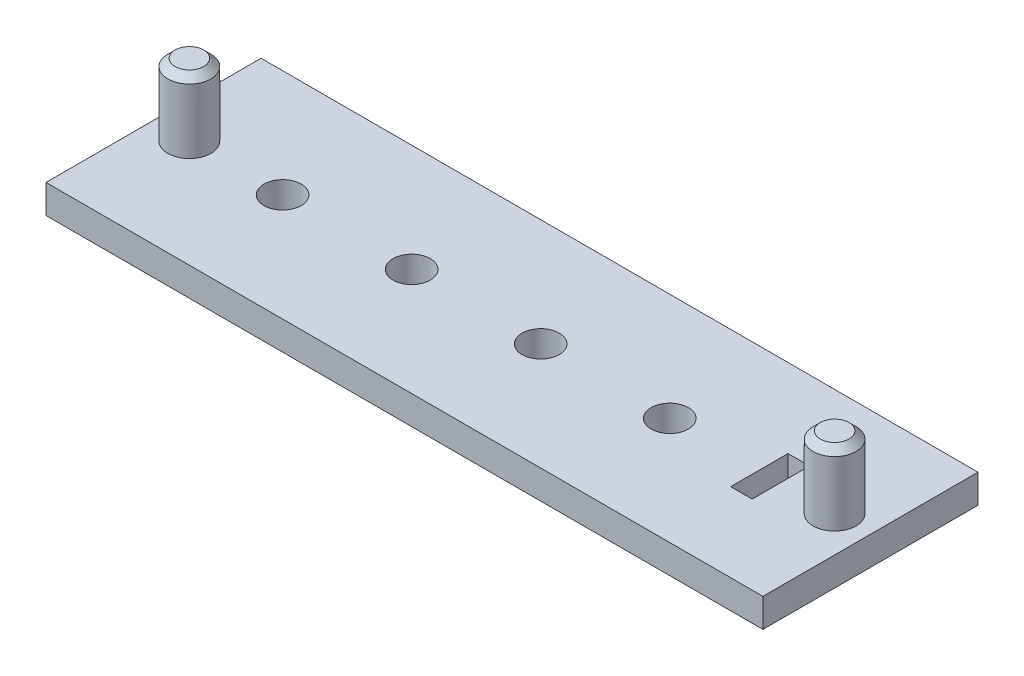
ISO-10303-21;
HEADER;
FILE_DESCRIPTION(('STEP AP214'),'2;1');
FILE_NAME('part.step','',(''),(''),'','','');
FILE_SCHEMA(('AUTOMOTIVE_DESIGN { 1 0 10303 214 1 1 1 1 }'));
ENDSEC;
DATA;
#1=APPLICATION_CONTEXT('core data for automotive mechanical design processes');
#2=APPLICATION_PROTOCOL_DEFINITION('international standard','automotive_design',2000,#1);
#3=PRODUCT_CONTEXT('',#1,'mechanical');
#4=PRODUCT('Part','Part','',(#3));
#5=PRODUCT_RELATED_PRODUCT_CATEGORY('part','',(#4));
#6=PRODUCT_DEFINITION_FORMATION('','',#4);
#7=PRODUCT_DEFINITION_CONTEXT('part definition',#1,'design');
#8=PRODUCT_DEFINITION('design','',#6,#7);
#9=PRODUCT_DEFINITION_SHAPE('','',#8);
#10=(LENGTH_UNIT() NAMED_UNIT(*) SI_UNIT(.MILLI.,.METRE.));
#11=(NAMED_UNIT(*) PLANE_ANGLE_UNIT() SI_UNIT($,.RADIAN.));
#12=(NAMED_UNIT(*) SI_UNIT($,.STERADIAN.) SOLID_ANGLE_UNIT());
#13=UNCERTAINTY_MEASURE_WITH_UNIT(LENGTH_MEASURE(1.E-05),#10,'distance_accuracy_value','');
#14=(GEOMETRIC_REPRESENTATION_CONTEXT(3) GLOBAL_UNCERTAINTY_ASSIGNED_CONTEXT((#13)) GLOBAL_UNIT_ASSIGNED_CONTEXT((#10,
#11,#12)) REPRESENTATION_CONTEXT('',''));
#15=CARTESIAN_POINT('',(0.,0.,0.));
#16=DIRECTION('',(0.,0.,1.));
#17=DIRECTION('',(1.,0.,0.));
#18=AXIS2_PLACEMENT_3D('',#15,#16,#17);
#19=CARTESIAN_POINT('',(0.,2.,0.));
#20=DIRECTION('',(0.,-1.,0.));
#21=DIRECTION('',(0.,0.,-1.));
#22=AXIS2_PLACEMENT_3D('',#19,#20,#21);
#23=PLANE('',#22);
#24=CARTESIAN_POINT('',(-22.5,2.,0.));
#25=DIRECTION('',(0.,-1.,0.));
#26=DIRECTION('',(0.,0.,-1.));
#27=AXIS2_PLACEMENT_3D('',#24,#25,#26);
#28=CIRCLE('',#27,1.5);
#29=CARTESIAN_POINT('',(-22.5,2.,-1.5));
#30=VERTEX_POINT('',#29);
#31=EDGE_CURVE('E174',#30,#30,#28,.F.);
#32=ORIENTED_EDGE('',*,*,#31,.F.);
#33=EDGE_LOOP('',(#32));
#34=FACE_BOUND('',#33,.T.);
#35=CARTESIAN_POINT('',(1.99999999999998,2.,0.));
#36=DIRECTION('',(0.,1.,0.));
#37=DIRECTION('',(0.,0.,1.));
#38=AXIS2_PLACEMENT_3D('',#35,#36,#37);
#39=CIRCLE('',#38,1.3);
#40=CARTESIAN_POINT('',(1.99999999999998,2.,1.3));
#41=VERTEX_POINT('',#40);
#42=EDGE_CURVE('E313',#41,#41,#39,.T.);
#43=ORIENTED_EDGE('',*,*,#42,.F.);
#44=EDGE_LOOP('',(#43));
#45=FACE_BOUND('',#44,.T.);
#46=DIRECTION('',(0.,0.,-1.));
#47=VECTOR('',#46,1.);
#48=CARTESIAN_POINT('',(18.75,2.,2.));
#49=LINE('',#48,#47);
#50=CARTESIAN_POINT('',(18.75,2.,2.));
#51=VERTEX_POINT('',#50);
#52=CARTESIAN_POINT('',(18.75,2.,-2.));
#53=VERTEX_POINT('',#52);
#54=EDGE_CURVE('E100',#51,#53,#49,.T.);
#55=ORIENTED_EDGE('',*,*,#54,.F.);
#56=DIRECTION('',(1.,0.,0.));
#57=VECTOR('',#56,1.);
#58=CARTESIAN_POINT('',(17.25,2.,2.));
#59=LINE('',#58,#57);
#60=CARTESIAN_POINT('',(17.25,2.,2.));
#61=VERTEX_POINT('',#60);
#62=EDGE_CURVE('E123',#61,#51,#59,.T.);
#63=ORIENTED_EDGE('',*,*,#62,.F.);
#64=DIRECTION('',(0.,0.,1.));
#65=VECTOR('',#64,1.);
#66=CARTESIAN_POINT('',(17.25,2.,2.));
#67=LINE('',#66,#65);
#68=CARTESIAN_POINT('',(17.25,2.,-2.));
#69=VERTEX_POINT('',#68);
#70=EDGE_CURVE('E121',#69,#61,#67,.T.);
#71=ORIENTED_EDGE('',*,*,#70,.F.);
#72=DIRECTION('',(-1.,0.,0.));
#73=VECTOR('',#72,1.);
#74=CARTESIAN_POINT('',(17.25,2.,-2.));
#75=LINE('',#74,#73);
#76=EDGE_CURVE('E108',#53,#69,#75,.T.);
#77=ORIENTED_EDGE('',*,*,#76,.F.);
#78=EDGE_LOOP('',(#55,#63,#71,#77));
#79=FACE_BOUND('',#78,.T.);
#80=DIRECTION('',(0.,0.,-1.));
#81=VECTOR('',#80,1.);
#82=CARTESIAN_POINT('',(25.,2.,7.5));
#83=LINE('',#82,#81);
#84=CARTESIAN_POINT('',(25.,2.,7.5));
#85=VERTEX_POINT('',#84);
#86=CARTESIAN_POINT('',(25.,2.,-7.5));
#87=VERTEX_POINT('',#86);
#88=EDGE_CURVE('E145',#85,#87,#83,.T.);
#89=ORIENTED_EDGE('',*,*,#88,.T.);
#90=DIRECTION('',(-1.,0.,0.));
#91=VECTOR('',#90,1.);
#92=CARTESIAN_POINT('',(-25.,2.,-7.5));
#93=LINE('',#92,#91);
#94=CARTESIAN_POINT('',(-25.,2.,-7.5));
#95=VERTEX_POINT('',#94);
#96=EDGE_CURVE('E148',#87,#95,#93,.T.);
#97=ORIENTED_EDGE('',*,*,#96,.T.);
#98=DIRECTION('',(0.,0.,1.));
#99=VECTOR('',#98,1.);
#100=CARTESIAN_POINT('',(-25.,2.,7.5));
#101=LINE('',#100,#99);
#102=CARTESIAN_POINT('',(-25.,2.,7.5));
#103=VERTEX_POINT('',#102);
#104=EDGE_CURVE('E151',#95,#103,#101,.T.);
#105=ORIENTED_EDGE('',*,*,#104,.T.);
#106=DIRECTION('',(1.,0.,0.));
#107=VECTOR('',#106,1.);
#108=CARTESIAN_POINT('',(-25.,2.,7.5));
#109=LINE('',#108,#107);
#110=EDGE_CURVE('E153',#103,#85,#109,.T.);
#111=ORIENTED_EDGE('',*,*,#110,.T.);
#112=EDGE_LOOP('',(#89,#97,#105,#111));
#113=FACE_BOUND('',#112,.T.);
#114=CARTESIAN_POINT('',(-16.,2.,0.));
#115=DIRECTION('',(0.,1.,0.));
#116=DIRECTION('',(0.,0.,1.));
#117=AXIS2_PLACEMENT_3D('',#114,#115,#116);
#118=CIRCLE('',#117,1.3);
#119=CARTESIAN_POINT('',(-16.,2.,1.3));
#120=VERTEX_POINT('',#119);
#121=EDGE_CURVE('E139',#120,#120,#118,.T.);
#122=ORIENTED_EDGE('',*,*,#121,.F.);
#123=EDGE_LOOP('',(#122));
#124=FACE_BOUND('',#123,.T.);
#125=CARTESIAN_POINT('',(-7.00000000000002,2.,0.));
#126=DIRECTION('',(0.,1.,0.));
#127=DIRECTION('',(0.,0.,1.));
#128=AXIS2_PLACEMENT_3D('',#125,#126,#127);
#129=CIRCLE('',#128,1.3);
#130=CARTESIAN_POINT('',(-7.00000000000002,2.,1.3));
#131=VERTEX_POINT('',#130);
#132=EDGE_CURVE('E129',#131,#131,#129,.T.);
#133=ORIENTED_EDGE('',*,*,#132,.F.);
#134=EDGE_LOOP('',(#133));
#135=FACE_BOUND('',#134,.T.);
#136=CARTESIAN_POINT('',(11.,2.,0.));
#137=DIRECTION('',(0.,1.,0.));
#138=DIRECTION('',(0.,0.,1.));
#139=AXIS2_PLACEMENT_3D('',#136,#137,#138);
#140=CIRCLE('',#139,1.3);
#141=CARTESIAN_POINT('',(11.,2.,1.3));
#142=VERTEX_POINT('',#141);
#143=EDGE_CURVE('E251',#142,#142,#140,.T.);
#144=ORIENTED_EDGE('',*,*,#143,.F.);
#145=EDGE_LOOP('',(#144));
#146=FACE_BOUND('',#145,.T.);
#147=CARTESIAN_POINT('',(22.5,2.,0.));
#148=DIRECTION('',(0.,-1.,0.));
#149=DIRECTION('',(0.,0.,-1.));
#150=AXIS2_PLACEMENT_3D('',#147,#148,#149);
#151=CIRCLE('',#150,1.5);
#152=CARTESIAN_POINT('',(22.5,2.,-1.5));
#153=VERTEX_POINT('',#152);
#154=EDGE_CURVE('E177',#153,#153,#151,.F.);
#155=ORIENTED_EDGE('',*,*,#154,.F.);
#156=EDGE_LOOP('',(#155));
#157=FACE_BOUND('',#156,.T.);
#158=ADVANCED_FACE('F35',(#34,#45,#79,#113,#124,#135,#146,#157),#23,.F.);
#159=CARTESIAN_POINT('',(0.,0.,0.));
#160=DIRECTION('',(0.,-1.,0.));
#161=DIRECTION('',(0.,0.,-1.));
#162=AXIS2_PLACEMENT_3D('',#159,#160,#161);
#163=PLANE('',#162);
#164=CARTESIAN_POINT('',(1.99999999999998,0.,0.));
#165=DIRECTION('',(0.,1.,0.));
#166=DIRECTION('',(0.,0.,1.));
#167=AXIS2_PLACEMENT_3D('',#164,#165,#166);
#168=CIRCLE('',#167,1.3);
#169=CARTESIAN_POINT('',(1.99999999999998,0.,1.3));
#170=VERTEX_POINT('',#169);
#171=EDGE_CURVE('E310',#170,#170,#168,.T.);
#172=ORIENTED_EDGE('',*,*,#171,.T.);
#173=EDGE_LOOP('',(#172));
#174=FACE_BOUND('',#173,.T.);
#175=DIRECTION('',(1.,0.,0.));
#176=VECTOR('',#175,1.);
#177=CARTESIAN_POINT('',(17.25,0.,2.));
#178=LINE('',#177,#176);
#179=CARTESIAN_POINT('',(17.25,0.,2.));
#180=VERTEX_POINT('',#179);
#181=CARTESIAN_POINT('',(18.75,0.,2.));
#182=VERTEX_POINT('',#181);
#183=EDGE_CURVE('E109',#180,#182,#178,.T.);
#184=ORIENTED_EDGE('',*,*,#183,.T.);
#185=DIRECTION('',(0.,0.,-1.));
#186=VECTOR('',#185,1.);
#187=CARTESIAN_POINT('',(18.75,0.,2.));
#188=LINE('',#187,#186);
#189=CARTESIAN_POINT('',(18.75,0.,-2.));
#190=VERTEX_POINT('',#189);
#191=EDGE_CURVE('E58',#182,#190,#188,.T.);
#192=ORIENTED_EDGE('',*,*,#191,.T.);
#193=DIRECTION('',(-1.,0.,0.));
#194=VECTOR('',#193,1.);
#195=CARTESIAN_POINT('',(17.25,0.,-2.));
#196=LINE('',#195,#194);
#197=CARTESIAN_POINT('',(17.25,0.,-2.));
#198=VERTEX_POINT('',#197);
#199=EDGE_CURVE('E115',#190,#198,#196,.T.);
#200=ORIENTED_EDGE('',*,*,#199,.T.);
#201=DIRECTION('',(0.,0.,1.));
#202=VECTOR('',#201,1.);
#203=CARTESIAN_POINT('',(17.25,0.,2.));
#204=LINE('',#203,#202);
#205=EDGE_CURVE('E131',#198,#180,#204,.T.);
#206=ORIENTED_EDGE('',*,*,#205,.T.);
#207=EDGE_LOOP('',(#184,#192,#200,#206));
#208=FACE_BOUND('',#207,.T.);
#209=DIRECTION('',(0.,0.,-1.));
#210=VECTOR('',#209,1.);
#211=CARTESIAN_POINT('',(25.,0.,7.5));
#212=LINE('',#211,#210);
#213=CARTESIAN_POINT('',(25.,0.,7.5));
#214=VERTEX_POINT('',#213);
#215=CARTESIAN_POINT('',(25.,0.,-7.5));
#216=VERTEX_POINT('',#215);
#217=EDGE_CURVE('E142',#214,#216,#212,.T.);
#218=ORIENTED_EDGE('',*,*,#217,.F.);
#219=DIRECTION('',(1.,0.,0.));
#220=VECTOR('',#219,1.);
#221=CARTESIAN_POINT('',(-25.,0.,7.5));
#222=LINE('',#221,#220);
#223=CARTESIAN_POINT('',(-25.,0.,7.5));
#224=VERTEX_POINT('',#223);
#225=EDGE_CURVE('E149',#224,#214,#222,.T.);
#226=ORIENTED_EDGE('',*,*,#225,.F.);
#227=DIRECTION('',(0.,0.,1.));
#228=VECTOR('',#227,1.);
#229=CARTESIAN_POINT('',(-25.,0.,7.5));
#230=LINE('',#229,#228);
#231=CARTESIAN_POINT('',(-25.,0.,-7.5));
#232=VERTEX_POINT('',#231);
#233=EDGE_CURVE('E160',#232,#224,#230,.T.);
#234=ORIENTED_EDGE('',*,*,#233,.F.);
#235=DIRECTION('',(-1.,0.,0.));
#236=VECTOR('',#235,1.);
#237=CARTESIAN_POINT('',(-25.,0.,-7.5));
#238=LINE('',#237,#236);
#239=EDGE_CURVE('E158',#216,#232,#238,.T.);
#240=ORIENTED_EDGE('',*,*,#239,.F.);
#241=EDGE_LOOP('',(#218,#226,#234,#240));
#242=FACE_BOUND('',#241,.T.);
#243=CARTESIAN_POINT('',(-16.,0.,0.));
#244=DIRECTION('',(0.,1.,0.));
#245=DIRECTION('',(0.,0.,1.));
#246=AXIS2_PLACEMENT_3D('',#243,#244,#245);
#247=CIRCLE('',#246,1.3);
#248=CARTESIAN_POINT('',(-16.,0.,1.3));
#249=VERTEX_POINT('',#248);
#250=EDGE_CURVE('E116',#249,#249,#247,.T.);
#251=ORIENTED_EDGE('',*,*,#250,.T.);
#252=EDGE_LOOP('',(#251));
#253=FACE_BOUND('',#252,.T.);
#254=CARTESIAN_POINT('',(-7.00000000000002,0.,0.));
#255=DIRECTION('',(0.,1.,0.));
#256=DIRECTION('',(0.,0.,1.));
#257=AXIS2_PLACEMENT_3D('',#254,#255,#256);
#258=CIRCLE('',#257,1.3);
#259=CARTESIAN_POINT('',(-7.00000000000002,0.,1.3));
#260=VERTEX_POINT('',#259);
#261=EDGE_CURVE('E304',#260,#260,#258,.T.);
#262=ORIENTED_EDGE('',*,*,#261,.T.);
#263=EDGE_LOOP('',(#262));
#264=FACE_BOUND('',#263,.T.);
#265=CARTESIAN_POINT('',(11.,0.,0.));
#266=DIRECTION('',(0.,1.,0.));
#267=DIRECTION('',(0.,0.,1.));
#268=AXIS2_PLACEMENT_3D('',#265,#266,#267);
#269=CIRCLE('',#268,1.3);
#270=CARTESIAN_POINT('',(11.,0.,1.3));
#271=VERTEX_POINT('',#270);
#272=EDGE_CURVE('E307',#271,#271,#269,.T.);
#273=ORIENTED_EDGE('',*,*,#272,.T.);
#274=EDGE_LOOP('',(#273));
#275=FACE_BOUND('',#274,.T.);
#276=ADVANCED_FACE('F199',(#174,#208,#242,#253,#264,#275),#163,.T.);
#277=CARTESIAN_POINT('',(25.,2.,7.5));
#278=DIRECTION('',(-1.,0.,0.));
#279=DIRECTION('',(0.,0.,1.));
#280=AXIS2_PLACEMENT_3D('',#277,#278,#279);
#281=PLANE('',#280);
#282=ORIENTED_EDGE('',*,*,#217,.T.);
#283=DIRECTION('',(0.,-1.,0.));
#284=VECTOR('',#283,1.);
#285=CARTESIAN_POINT('',(25.,2.,-7.5));
#286=LINE('',#285,#284);
#287=EDGE_CURVE('E171',#87,#216,#286,.T.);
#288=ORIENTED_EDGE('',*,*,#287,.F.);
#289=ORIENTED_EDGE('',*,*,#88,.F.);
#290=DIRECTION('',(0.,-1.,0.));
#291=VECTOR('',#290,1.);
#292=CARTESIAN_POINT('',(25.,2.,7.5));
#293=LINE('',#292,#291);
#294=EDGE_CURVE('E155',#85,#214,#293,.T.);
#295=ORIENTED_EDGE('',*,*,#294,.T.);
#296=EDGE_LOOP('',(#282,#288,#289,#295));
#297=FACE_BOUND('',#296,.T.);
#298=ADVANCED_FACE('F205',(#297),#281,.F.);
#299=CARTESIAN_POINT('',(-25.,2.,-7.5));
#300=DIRECTION('',(0.,0.,1.));
#301=DIRECTION('',(1.,0.,0.));
#302=AXIS2_PLACEMENT_3D('',#299,#300,#301);
#303=PLANE('',#302);
#304=ORIENTED_EDGE('',*,*,#239,.T.);
#305=DIRECTION('',(0.,-1.,0.));
#306=VECTOR('',#305,1.);
#307=CARTESIAN_POINT('',(-25.,2.,-7.5));
#308=LINE('',#307,#306);
#309=EDGE_CURVE('E168',#95,#232,#308,.T.);
#310=ORIENTED_EDGE('',*,*,#309,.F.);
#311=ORIENTED_EDGE('',*,*,#96,.F.);
#312=ORIENTED_EDGE('',*,*,#287,.T.);
#313=EDGE_LOOP('',(#304,#310,#311,#312));
#314=FACE_BOUND('',#313,.T.);
#315=ADVANCED_FACE('F221',(#314),#303,.F.);
#316=CARTESIAN_POINT('',(-25.,2.,7.5));
#317=DIRECTION('',(1.,0.,0.));
#318=DIRECTION('',(0.,0.,-1.));
#319=AXIS2_PLACEMENT_3D('',#316,#317,#318);
#320=PLANE('',#319);
#321=ORIENTED_EDGE('',*,*,#233,.T.);
#322=DIRECTION('',(0.,-1.,0.));
#323=VECTOR('',#322,1.);
#324=CARTESIAN_POINT('',(-25.,2.,7.5));
#325=LINE('',#324,#323);
#326=EDGE_CURVE('E165',#103,#224,#325,.T.);
#327=ORIENTED_EDGE('',*,*,#326,.F.);
#328=ORIENTED_EDGE('',*,*,#104,.F.);
#329=ORIENTED_EDGE('',*,*,#309,.T.);
#330=EDGE_LOOP('',(#321,#327,#328,#329));
#331=FACE_BOUND('',#330,.T.);
#332=ADVANCED_FACE('F217',(#331),#320,.F.);
#333=CARTESIAN_POINT('',(-25.,2.,7.5));
#334=DIRECTION('',(0.,0.,-1.));
#335=DIRECTION('',(-1.,0.,0.));
#336=AXIS2_PLACEMENT_3D('',#333,#334,#335);
#337=PLANE('',#336);
#338=ORIENTED_EDGE('',*,*,#225,.T.);
#339=ORIENTED_EDGE('',*,*,#294,.F.);
#340=ORIENTED_EDGE('',*,*,#110,.F.);
#341=ORIENTED_EDGE('',*,*,#326,.T.);
#342=EDGE_LOOP('',(#338,#339,#340,#341));
#343=FACE_BOUND('',#342,.T.);
#344=ADVANCED_FACE('F214',(#343),#337,.F.);
#345=CARTESIAN_POINT('',(-16.,2.,0.));
#346=DIRECTION('',(0.,-1.,0.));
#347=DIRECTION('',(0.,0.,-1.));
#348=AXIS2_PLACEMENT_3D('',#345,#346,#347);
#349=CYLINDRICAL_SURFACE('',#348,1.3);
#350=ORIENTED_EDGE('',*,*,#121,.T.);
#351=EDGE_LOOP('',(#350));
#352=FACE_BOUND('',#351,.T.);
#353=ORIENTED_EDGE('',*,*,#250,.F.);
#354=EDGE_LOOP('',(#353));
#355=FACE_BOUND('',#354,.T.);
#356=ADVANCED_FACE('F211',(#352,#355),#349,.F.);
#357=CARTESIAN_POINT('',(18.75,2.,2.));
#358=DIRECTION('',(-1.,0.,0.));
#359=DIRECTION('',(0.,0.,1.));
#360=AXIS2_PLACEMENT_3D('',#357,#358,#359);
#361=PLANE('',#360);
#362=ORIENTED_EDGE('',*,*,#191,.F.);
#363=DIRECTION('',(0.,-1.,0.));
#364=VECTOR('',#363,1.);
#365=CARTESIAN_POINT('',(18.75,2.,2.));
#366=LINE('',#365,#364);
#367=EDGE_CURVE('E104',#51,#182,#366,.T.);
#368=ORIENTED_EDGE('',*,*,#367,.F.);
#369=ORIENTED_EDGE('',*,*,#54,.T.);
#370=DIRECTION('',(0.,-1.,0.));
#371=VECTOR('',#370,1.);
#372=CARTESIAN_POINT('',(18.75,2.,-2.));
#373=LINE('',#372,#371);
#374=EDGE_CURVE('E103',#53,#190,#373,.T.);
#375=ORIENTED_EDGE('',*,*,#374,.T.);
#376=EDGE_LOOP('',(#362,#368,#369,#375));
#377=FACE_BOUND('',#376,.T.);
#378=ADVANCED_FACE('F102',(#377),#361,.T.);
#379=CARTESIAN_POINT('',(17.25,2.,-2.));
#380=DIRECTION('',(0.,0.,1.));
#381=DIRECTION('',(1.,0.,0.));
#382=AXIS2_PLACEMENT_3D('',#379,#380,#381);
#383=PLANE('',#382);
#384=ORIENTED_EDGE('',*,*,#199,.F.);
#385=ORIENTED_EDGE('',*,*,#374,.F.);
#386=ORIENTED_EDGE('',*,*,#76,.T.);
#387=DIRECTION('',(0.,-1.,0.));
#388=VECTOR('',#387,1.);
#389=CARTESIAN_POINT('',(17.25,2.,-2.));
#390=LINE('',#389,#388);
#391=EDGE_CURVE('E117',#69,#198,#390,.T.);
#392=ORIENTED_EDGE('',*,*,#391,.T.);
#393=EDGE_LOOP('',(#384,#385,#386,#392));
#394=FACE_BOUND('',#393,.T.);
#395=ADVANCED_FACE('F112',(#394),#383,.T.);
#396=CARTESIAN_POINT('',(17.25,2.,2.));
#397=DIRECTION('',(1.,0.,0.));
#398=DIRECTION('',(0.,0.,-1.));
#399=AXIS2_PLACEMENT_3D('',#396,#397,#398);
#400=PLANE('',#399);
#401=ORIENTED_EDGE('',*,*,#205,.F.);
#402=ORIENTED_EDGE('',*,*,#391,.F.);
#403=ORIENTED_EDGE('',*,*,#70,.T.);
#404=DIRECTION('',(0.,-1.,0.));
#405=VECTOR('',#404,1.);
#406=CARTESIAN_POINT('',(17.25,2.,2.));
#407=LINE('',#406,#405);
#408=EDGE_CURVE('E50',#61,#180,#407,.T.);
#409=ORIENTED_EDGE('',*,*,#408,.T.);
#410=EDGE_LOOP('',(#401,#402,#403,#409));
#411=FACE_BOUND('',#410,.T.);
#412=ADVANCED_FACE('F286',(#411),#400,.T.);
#413=CARTESIAN_POINT('',(17.25,2.,2.));
#414=DIRECTION('',(0.,0.,-1.));
#415=DIRECTION('',(-1.,0.,0.));
#416=AXIS2_PLACEMENT_3D('',#413,#414,#415);
#417=PLANE('',#416);
#418=ORIENTED_EDGE('',*,*,#183,.F.);
#419=ORIENTED_EDGE('',*,*,#408,.F.);
#420=ORIENTED_EDGE('',*,*,#62,.T.);
#421=ORIENTED_EDGE('',*,*,#367,.T.);
#422=EDGE_LOOP('',(#418,#419,#420,#421));
#423=FACE_BOUND('',#422,.T.);
#424=ADVANCED_FACE('F282',(#423),#417,.T.);
#425=CARTESIAN_POINT('',(-7.00000000000002,2.,0.));
#426=DIRECTION('',(0.,-1.,0.));
#427=DIRECTION('',(0.,0.,-1.));
#428=AXIS2_PLACEMENT_3D('',#425,#426,#427);
#429=CYLINDRICAL_SURFACE('',#428,1.3);
#430=ORIENTED_EDGE('',*,*,#132,.T.);
#431=EDGE_LOOP('',(#430));
#432=FACE_BOUND('',#431,.T.);
#433=ORIENTED_EDGE('',*,*,#261,.F.);
#434=EDGE_LOOP('',(#433));
#435=FACE_BOUND('',#434,.T.);
#436=ADVANCED_FACE('F278',(#432,#435),#429,.F.);
#437=CARTESIAN_POINT('',(1.99999999999998,2.,0.));
#438=DIRECTION('',(0.,-1.,0.));
#439=DIRECTION('',(0.,0.,-1.));
#440=AXIS2_PLACEMENT_3D('',#437,#438,#439);
#441=CYLINDRICAL_SURFACE('',#440,1.3);
#442=ORIENTED_EDGE('',*,*,#42,.T.);
#443=EDGE_LOOP('',(#442));
#444=FACE_BOUND('',#443,.T.);
#445=ORIENTED_EDGE('',*,*,#171,.F.);
#446=EDGE_LOOP('',(#445));
#447=FACE_BOUND('',#446,.T.);
#448=ADVANCED_FACE('F274',(#444,#447),#441,.F.);
#449=CARTESIAN_POINT('',(11.,2.,0.));
#450=DIRECTION('',(0.,-1.,0.));
#451=DIRECTION('',(0.,0.,-1.));
#452=AXIS2_PLACEMENT_3D('',#449,#450,#451);
#453=CYLINDRICAL_SURFACE('',#452,1.3);
#454=ORIENTED_EDGE('',*,*,#143,.T.);
#455=EDGE_LOOP('',(#454));
#456=FACE_BOUND('',#455,.T.);
#457=ORIENTED_EDGE('',*,*,#272,.F.);
#458=EDGE_LOOP('',(#457));
#459=FACE_BOUND('',#458,.T.);
#460=ADVANCED_FACE('F270',(#456,#459),#453,.F.);
#461=CARTESIAN_POINT('',(-22.5,7.,0.));
#462=DIRECTION('',(0.,-1.,0.));
#463=DIRECTION('',(0.,0.,-1.));
#464=AXIS2_PLACEMENT_3D('',#461,#462,#463);
#465=CYLINDRICAL_SURFACE('',#464,1.5);
#466=CARTESIAN_POINT('',(-22.5,6.49999999999999,0.));
#467=DIRECTION('',(0.,1.,0.));
#468=DIRECTION('',(0.,0.,1.));
#469=AXIS2_PLACEMENT_3D('',#466,#467,#468);
#470=CIRCLE('',#469,1.5);
#471=CARTESIAN_POINT('',(-22.5,6.49999999999999,1.5));
#472=VERTEX_POINT('',#471);
#473=EDGE_CURVE('E183',#472,#472,#470,.F.);
#474=ORIENTED_EDGE('',*,*,#473,.T.);
#475=EDGE_LOOP('',(#474));
#476=FACE_BOUND('',#475,.T.);
#477=ORIENTED_EDGE('',*,*,#31,.T.);
#478=EDGE_LOOP('',(#477));
#479=FACE_BOUND('',#478,.T.);
#480=ADVANCED_FACE('F264',(#476,#479),#465,.T.);
#481=CARTESIAN_POINT('',(-22.5,7.,0.));
#482=DIRECTION('',(0.,1.,0.));
#483=DIRECTION('',(0.,0.,1.));
#484=AXIS2_PLACEMENT_3D('',#481,#482,#483);
#485=PLANE('',#484);
#486=CARTESIAN_POINT('',(-22.5,7.,0.));
#487=DIRECTION('',(0.,1.,0.));
#488=DIRECTION('',(0.,0.,1.));
#489=AXIS2_PLACEMENT_3D('',#486,#487,#488);
#490=CIRCLE('',#489,0.999999999999994);
#491=CARTESIAN_POINT('',(-22.5,7.,0.999999999999994));
#492=VERTEX_POINT('',#491);
#493=EDGE_CURVE('E180',#492,#492,#490,.T.);
#494=ORIENTED_EDGE('',*,*,#493,.T.);
#495=EDGE_LOOP('',(#494));
#496=FACE_BOUND('',#495,.T.);
#497=ADVANCED_FACE('F256',(#496),#485,.T.);
#498=CARTESIAN_POINT('',(22.5,7.,0.));
#499=DIRECTION('',(0.,-1.,0.));
#500=DIRECTION('',(0.,0.,-1.));
#501=AXIS2_PLACEMENT_3D('',#498,#499,#500);
#502=CYLINDRICAL_SURFACE('',#501,1.5);
#503=CARTESIAN_POINT('',(22.5,6.49999999999999,0.));
#504=DIRECTION('',(0.,1.,0.));
#505=DIRECTION('',(0.,0.,1.));
#506=AXIS2_PLACEMENT_3D('',#503,#504,#505);
#507=CIRCLE('',#506,1.5);
#508=CARTESIAN_POINT('',(22.5,6.49999999999999,1.5));
#509=VERTEX_POINT('',#508);
#510=EDGE_CURVE('E11',#509,#509,#507,.F.);
#511=ORIENTED_EDGE('',*,*,#510,.T.);
#512=EDGE_LOOP('',(#511));
#513=FACE_BOUND('',#512,.T.);
#514=ORIENTED_EDGE('',*,*,#154,.T.);
#515=EDGE_LOOP('',(#514));
#516=FACE_BOUND('',#515,.T.);
#517=ADVANCED_FACE('F254',(#513,#516),#502,.T.);
#518=CARTESIAN_POINT('',(22.5,7.,0.));
#519=DIRECTION('',(0.,1.,0.));
#520=DIRECTION('',(0.,0.,1.));
#521=AXIS2_PLACEMENT_3D('',#518,#519,#520);
#522=PLANE('',#521);
#523=CARTESIAN_POINT('',(22.5,7.,0.));
#524=DIRECTION('',(0.,1.,0.));
#525=DIRECTION('',(0.,0.,1.));
#526=AXIS2_PLACEMENT_3D('',#523,#524,#525);
#527=CIRCLE('',#526,0.999999999999994);
#528=CARTESIAN_POINT('',(22.5,7.,0.999999999999994));
#529=VERTEX_POINT('',#528);
#530=EDGE_CURVE('E43',#529,#529,#527,.T.);
#531=ORIENTED_EDGE('',*,*,#530,.T.);
#532=EDGE_LOOP('',(#531));
#533=FACE_BOUND('',#532,.T.);
#534=ADVANCED_FACE('F188',(#533),#522,.T.);
#535=CARTESIAN_POINT('',(-22.5,7.,0.));
#536=DIRECTION('',(0.,-1.,0.));
#537=DIRECTION('',(0.,0.,-1.));
#538=AXIS2_PLACEMENT_3D('',#535,#536,#537);
#539=CONICAL_SURFACE('',#538,0.999999999999994,0.785398163397443);
#540=ORIENTED_EDGE('',*,*,#473,.F.);
#541=EDGE_LOOP('',(#540));
#542=FACE_BOUND('',#541,.T.);
#543=ORIENTED_EDGE('',*,*,#493,.F.);
#544=EDGE_LOOP('',(#543));
#545=FACE_BOUND('',#544,.T.);
#546=ADVANCED_FACE('F191',(#542,#545),#539,.T.);
#547=CARTESIAN_POINT('',(22.5,7.,0.));
#548=DIRECTION('',(0.,-1.,0.));
#549=DIRECTION('',(0.,0.,-1.));
#550=AXIS2_PLACEMENT_3D('',#547,#548,#549);
#551=CONICAL_SURFACE('',#550,0.999999999999994,0.785398163397443);
#552=ORIENTED_EDGE('',*,*,#510,.F.);
#553=EDGE_LOOP('',(#552));
#554=FACE_BOUND('',#553,.T.);
#555=ORIENTED_EDGE('',*,*,#530,.F.);
#556=EDGE_LOOP('',(#555));
#557=FACE_BOUND('',#556,.T.);
#558=ADVANCED_FACE('F37',(#554,#557),#551,.T.);
#559=CLOSED_SHELL('',(#158,#276,#298,#315,#332,#344,#356,#378,#395,#412,#424,#436,#448,#460,
#480,#497,#517,#534,#546,#558));
#560=MANIFOLD_SOLID_BREP('B2',#559);
#561=ADVANCED_BREP_SHAPE_REPRESENTATION('',(#18,#560),#14);
#562=SHAPE_DEFINITION_REPRESENTATION(#9,#561);
ENDSEC;
END-ISO-10303-21;
